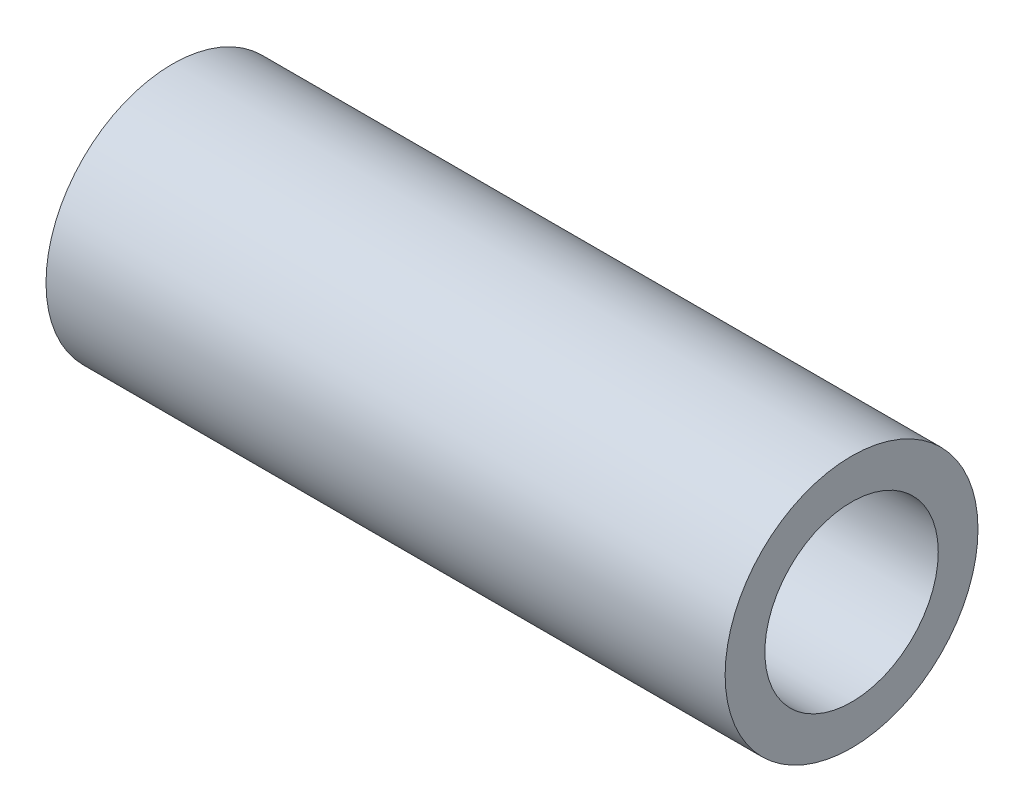
ISO-10303-21;
HEADER;
FILE_DESCRIPTION(('STEP AP214'),'2;1');
FILE_NAME('part.step','',(''),(''),'','','');
FILE_SCHEMA(('AUTOMOTIVE_DESIGN { 1 0 10303 214 1 1 1 1 }'));
ENDSEC;
DATA;
#1=APPLICATION_CONTEXT('core data for automotive mechanical design processes');
#2=APPLICATION_PROTOCOL_DEFINITION('international standard','automotive_design',2000,#1);
#3=PRODUCT_CONTEXT('',#1,'mechanical');
#4=PRODUCT('Part','Part','',(#3));
#5=PRODUCT_RELATED_PRODUCT_CATEGORY('part','',(#4));
#6=PRODUCT_DEFINITION_FORMATION('','',#4);
#7=PRODUCT_DEFINITION_CONTEXT('part definition',#1,'design');
#8=PRODUCT_DEFINITION('design','',#6,#7);
#9=PRODUCT_DEFINITION_SHAPE('','',#8);
#10=(LENGTH_UNIT() NAMED_UNIT(*) SI_UNIT(.MILLI.,.METRE.));
#11=(NAMED_UNIT(*) PLANE_ANGLE_UNIT() SI_UNIT($,.RADIAN.));
#12=(NAMED_UNIT(*) SI_UNIT($,.STERADIAN.) SOLID_ANGLE_UNIT());
#13=UNCERTAINTY_MEASURE_WITH_UNIT(LENGTH_MEASURE(1.E-05),#10,'distance_accuracy_value','');
#14=(GEOMETRIC_REPRESENTATION_CONTEXT(3) GLOBAL_UNCERTAINTY_ASSIGNED_CONTEXT((#13)) GLOBAL_UNIT_ASSIGNED_CONTEXT((#10,
#11,#12)) REPRESENTATION_CONTEXT('',''));
#15=CARTESIAN_POINT('',(0.,0.,0.));
#16=DIRECTION('',(0.,0.,1.));
#17=DIRECTION('',(1.,0.,0.));
#18=AXIS2_PLACEMENT_3D('',#15,#16,#17);
#19=CARTESIAN_POINT('',(23.876,0.,0.));
#20=DIRECTION('',(-1.,0.,0.));
#21=DIRECTION('',(0.,0.,1.));
#22=AXIS2_PLACEMENT_3D('',#19,#20,#21);
#23=CYLINDRICAL_SURFACE('',#22,3.048);
#24=CARTESIAN_POINT('',(23.876,0.,0.));
#25=DIRECTION('',(1.,0.,0.));
#26=DIRECTION('',(0.,0.,-1.));
#27=AXIS2_PLACEMENT_3D('',#24,#25,#26);
#28=CIRCLE('',#27,3.048);
#29=CARTESIAN_POINT('',(23.876,0.,-3.048));
#30=VERTEX_POINT('',#29);
#31=EDGE_CURVE('E42',#30,#30,#28,.T.);
#32=ORIENTED_EDGE('',*,*,#31,.T.);
#33=EDGE_LOOP('',(#32));
#34=FACE_BOUND('',#33,.T.);
#35=CARTESIAN_POINT('',(0.,0.,0.));
#36=DIRECTION('',(1.,0.,0.));
#37=DIRECTION('',(0.,0.,-1.));
#38=AXIS2_PLACEMENT_3D('',#35,#36,#37);
#39=CIRCLE('',#38,3.048);
#40=CARTESIAN_POINT('',(0.,0.,-3.048));
#41=VERTEX_POINT('',#40);
#42=EDGE_CURVE('E48',#41,#41,#39,.T.);
#43=ORIENTED_EDGE('',*,*,#42,.F.);
#44=EDGE_LOOP('',(#43));
#45=FACE_BOUND('',#44,.T.);
#46=ADVANCED_FACE('F35',(#34,#45),#23,.F.);
#47=CARTESIAN_POINT('',(23.876,0.,0.));
#48=DIRECTION('',(-1.,0.,0.));
#49=DIRECTION('',(0.,0.,1.));
#50=AXIS2_PLACEMENT_3D('',#47,#48,#49);
#51=CYLINDRICAL_SURFACE('',#50,4.445);
#52=CARTESIAN_POINT('',(23.876,0.,0.));
#53=DIRECTION('',(1.,0.,0.));
#54=DIRECTION('',(0.,0.,-1.));
#55=AXIS2_PLACEMENT_3D('',#52,#53,#54);
#56=CIRCLE('',#55,4.445);
#57=CARTESIAN_POINT('',(23.876,0.,-4.445));
#58=VERTEX_POINT('',#57);
#59=EDGE_CURVE('E10',#58,#58,#56,.T.);
#60=ORIENTED_EDGE('',*,*,#59,.F.);
#61=EDGE_LOOP('',(#60));
#62=FACE_BOUND('',#61,.T.);
#63=CARTESIAN_POINT('',(0.,0.,0.));
#64=DIRECTION('',(1.,0.,0.));
#65=DIRECTION('',(0.,0.,-1.));
#66=AXIS2_PLACEMENT_3D('',#63,#64,#65);
#67=CIRCLE('',#66,4.445);
#68=CARTESIAN_POINT('',(0.,0.,-4.445));
#69=VERTEX_POINT('',#68);
#70=EDGE_CURVE('E38',#69,#69,#67,.T.);
#71=ORIENTED_EDGE('',*,*,#70,.T.);
#72=EDGE_LOOP('',(#71));
#73=FACE_BOUND('',#72,.T.);
#74=ADVANCED_FACE('F55',(#62,#73),#51,.T.);
#75=CARTESIAN_POINT('',(23.876,0.,0.));
#76=DIRECTION('',(1.,0.,0.));
#77=DIRECTION('',(0.,0.,-1.));
#78=AXIS2_PLACEMENT_3D('',#75,#76,#77);
#79=PLANE('',#78);
#80=ORIENTED_EDGE('',*,*,#31,.F.);
#81=EDGE_LOOP('',(#80));
#82=FACE_BOUND('',#81,.T.);
#83=ORIENTED_EDGE('',*,*,#59,.T.);
#84=EDGE_LOOP('',(#83));
#85=FACE_BOUND('',#84,.T.);
#86=ADVANCED_FACE('F59',(#82,#85),#79,.T.);
#87=CARTESIAN_POINT('',(0.,0.,0.));
#88=DIRECTION('',(1.,0.,0.));
#89=DIRECTION('',(0.,0.,-1.));
#90=AXIS2_PLACEMENT_3D('',#87,#88,#89);
#91=PLANE('',#90);
#92=ORIENTED_EDGE('',*,*,#42,.T.);
#93=EDGE_LOOP('',(#92));
#94=FACE_BOUND('',#93,.T.);
#95=ORIENTED_EDGE('',*,*,#70,.F.);
#96=EDGE_LOOP('',(#95));
#97=FACE_BOUND('',#96,.T.);
#98=ADVANCED_FACE('F57',(#94,#97),#91,.F.);
#99=CLOSED_SHELL('',(#46,#74,#86,#98));
#100=MANIFOLD_SOLID_BREP('B2',#99);
#101=ADVANCED_BREP_SHAPE_REPRESENTATION('',(#18,#100),#14);
#102=SHAPE_DEFINITION_REPRESENTATION(#9,#101);
ENDSEC;
END-ISO-10303-21;
